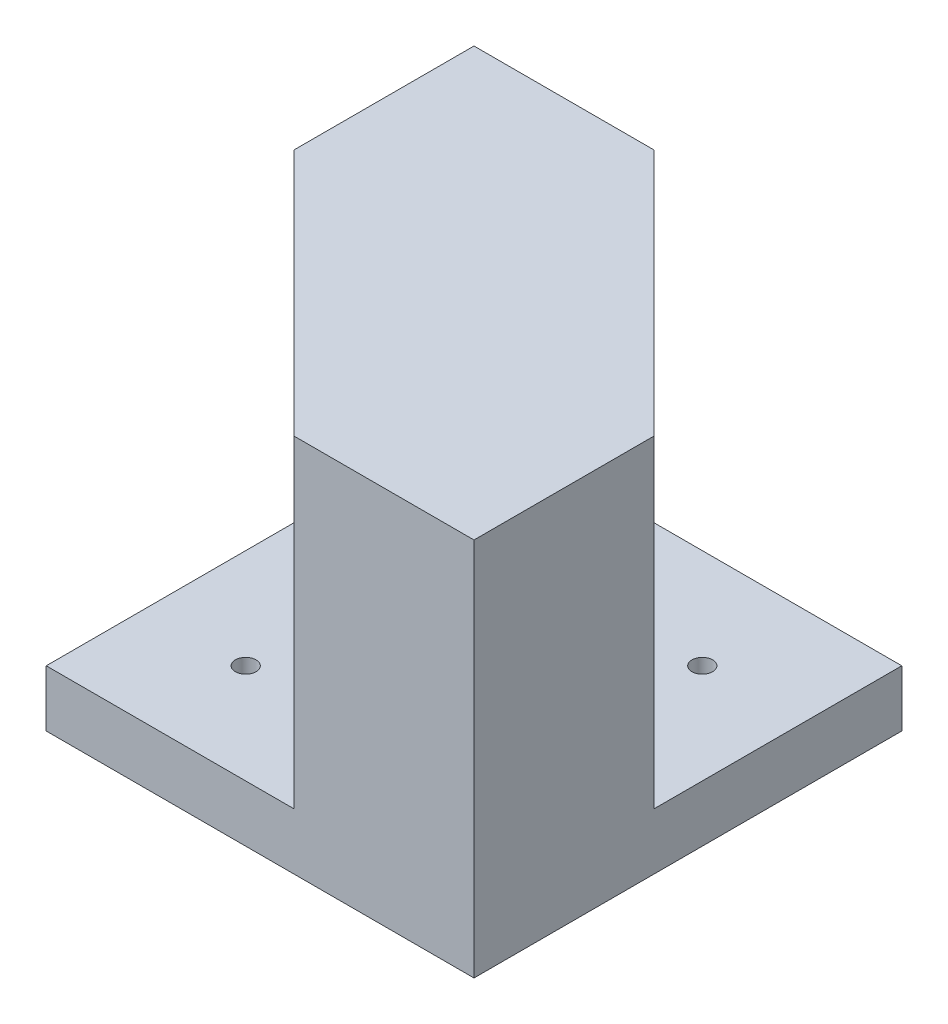
ISO-10303-21;
HEADER;
FILE_DESCRIPTION(('STEP AP214'),'2;1');
FILE_NAME('part.step','',(''),(''),'','','');
FILE_SCHEMA(('AUTOMOTIVE_DESIGN { 1 0 10303 214 1 1 1 1 }'));
ENDSEC;
DATA;
#1=APPLICATION_CONTEXT('core data for automotive mechanical design processes');
#2=APPLICATION_PROTOCOL_DEFINITION('international standard','automotive_design',2000,#1);
#3=PRODUCT_CONTEXT('',#1,'mechanical');
#4=PRODUCT('Part','Part','',(#3));
#5=PRODUCT_RELATED_PRODUCT_CATEGORY('part','',(#4));
#6=PRODUCT_DEFINITION_FORMATION('','',#4);
#7=PRODUCT_DEFINITION_CONTEXT('part definition',#1,'design');
#8=PRODUCT_DEFINITION('design','',#6,#7);
#9=PRODUCT_DEFINITION_SHAPE('','',#8);
#10=(LENGTH_UNIT() NAMED_UNIT(*) SI_UNIT(.MILLI.,.METRE.));
#11=(NAMED_UNIT(*) PLANE_ANGLE_UNIT() SI_UNIT($,.RADIAN.));
#12=(NAMED_UNIT(*) SI_UNIT($,.STERADIAN.) SOLID_ANGLE_UNIT());
#13=UNCERTAINTY_MEASURE_WITH_UNIT(LENGTH_MEASURE(1.E-05),#10,'distance_accuracy_value','');
#14=(GEOMETRIC_REPRESENTATION_CONTEXT(3) GLOBAL_UNCERTAINTY_ASSIGNED_CONTEXT((#13)) GLOBAL_UNIT_ASSIGNED_CONTEXT((#10,
#11,#12)) REPRESENTATION_CONTEXT('',''));
#15=CARTESIAN_POINT('',(0.,0.,0.));
#16=DIRECTION('',(0.,0.,1.));
#17=DIRECTION('',(1.,0.,0.));
#18=AXIS2_PLACEMENT_3D('',#15,#16,#17);
#19=CARTESIAN_POINT('',(0.,8.89,0.));
#20=DIRECTION('',(0.,1.,0.));
#21=DIRECTION('',(0.,0.,1.));
#22=AXIS2_PLACEMENT_3D('',#19,#20,#21);
#23=PLANE('',#22);
#24=DIRECTION('',(-0.707106781186546,0.,-0.707106781186549));
#25=VECTOR('',#24,1.);
#26=CARTESIAN_POINT('',(14.142135623731,8.89,-14.1421356237309));
#27=LINE('',#26,#25);
#28=CARTESIAN_POINT('',(33.655,8.89,5.37072875253817));
#29=VERTEX_POINT('',#28);
#30=CARTESIAN_POINT('',(-5.37072875253806,8.89,-33.655));
#31=VERTEX_POINT('',#30);
#32=EDGE_CURVE('E131',#29,#31,#27,.T.);
#33=ORIENTED_EDGE('',*,*,#32,.F.);
#34=DIRECTION('',(0.,0.,-1.));
#35=VECTOR('',#34,1.);
#36=CARTESIAN_POINT('',(33.655,8.89,-33.655));
#37=LINE('',#36,#35);
#38=CARTESIAN_POINT('',(33.655,8.89,-33.655));
#39=VERTEX_POINT('',#38);
#40=EDGE_CURVE('E154',#29,#39,#37,.T.);
#41=ORIENTED_EDGE('',*,*,#40,.T.);
#42=DIRECTION('',(-1.,0.,0.));
#43=VECTOR('',#42,1.);
#44=CARTESIAN_POINT('',(-33.655,8.89,-33.655));
#45=LINE('',#44,#43);
#46=EDGE_CURVE('E69',#39,#31,#45,.T.);
#47=ORIENTED_EDGE('',*,*,#46,.T.);
#48=EDGE_LOOP('',(#33,#41,#47));
#49=FACE_BOUND('',#48,.T.);
#50=CARTESIAN_POINT('',(17.9605122421383,8.89,-17.9605122421383));
#51=DIRECTION('',(0.,1.,0.));
#52=DIRECTION('',(0.,0.,1.));
#53=AXIS2_PLACEMENT_3D('',#50,#51,#52);
#54=CIRCLE('',#53,1.625);
#55=CARTESIAN_POINT('',(17.9605122421383,8.89,-16.3355122421383));
#56=VERTEX_POINT('',#55);
#57=EDGE_CURVE('E148',#56,#56,#54,.T.);
#58=ORIENTED_EDGE('',*,*,#57,.F.);
#59=EDGE_LOOP('',(#58));
#60=FACE_BOUND('',#59,.T.);
#61=ADVANCED_FACE('F44',(#49,#60),#23,.T.);
#62=DIRECTION('',(0.707106781186546,0.,0.707106781186549));
#63=VECTOR('',#62,1.);
#64=CARTESIAN_POINT('',(-14.142135623731,8.89,14.1421356237309));
#65=LINE('',#64,#63);
#66=CARTESIAN_POINT('',(-33.655,8.89,-5.37072875253819));
#67=VERTEX_POINT('',#66);
#68=CARTESIAN_POINT('',(5.37072875253804,8.89,33.655));
#69=VERTEX_POINT('',#68);
#70=EDGE_CURVE('E61',#67,#69,#65,.T.);
#71=ORIENTED_EDGE('',*,*,#70,.F.);
#72=DIRECTION('',(0.,0.,1.));
#73=VECTOR('',#72,1.);
#74=CARTESIAN_POINT('',(-33.655,8.89,-33.655));
#75=LINE('',#74,#73);
#76=CARTESIAN_POINT('',(-33.655,8.89,33.655));
#77=VERTEX_POINT('',#76);
#78=EDGE_CURVE('E135',#67,#77,#75,.T.);
#79=ORIENTED_EDGE('',*,*,#78,.T.);
#80=DIRECTION('',(1.,0.,0.));
#81=VECTOR('',#80,1.);
#82=CARTESIAN_POINT('',(-33.655,8.89,33.655));
#83=LINE('',#82,#81);
#84=EDGE_CURVE('E159',#77,#69,#83,.T.);
#85=ORIENTED_EDGE('',*,*,#84,.T.);
#86=EDGE_LOOP('',(#71,#79,#85));
#87=FACE_BOUND('',#86,.T.);
#88=CARTESIAN_POINT('',(-17.9605122421383,8.89,17.9605122421383));
#89=DIRECTION('',(0.,1.,0.));
#90=DIRECTION('',(0.,0.,1.));
#91=AXIS2_PLACEMENT_3D('',#88,#89,#90);
#92=CIRCLE('',#91,1.625);
#93=CARTESIAN_POINT('',(-17.9605122421383,8.89,19.5855122421383));
#94=VERTEX_POINT('',#93);
#95=EDGE_CURVE('E139',#94,#94,#92,.T.);
#96=ORIENTED_EDGE('',*,*,#95,.F.);
#97=EDGE_LOOP('',(#96));
#98=FACE_BOUND('',#97,.T.);
#99=ADVANCED_FACE('F257',(#87,#98),#23,.T.);
#100=CARTESIAN_POINT('',(0.,0.,0.));
#101=DIRECTION('',(0.,1.,0.));
#102=DIRECTION('',(0.,0.,1.));
#103=AXIS2_PLACEMENT_3D('',#100,#101,#102);
#104=PLANE('',#103);
#105=DIRECTION('',(0.,0.,-1.));
#106=VECTOR('',#105,1.);
#107=CARTESIAN_POINT('',(33.655,0.,-33.655));
#108=LINE('',#107,#106);
#109=CARTESIAN_POINT('',(33.655,0.,33.655));
#110=VERTEX_POINT('',#109);
#111=CARTESIAN_POINT('',(33.655,0.,-33.655));
#112=VERTEX_POINT('',#111);
#113=EDGE_CURVE('E151',#110,#112,#108,.T.);
#114=ORIENTED_EDGE('',*,*,#113,.F.);
#115=DIRECTION('',(1.,0.,0.));
#116=VECTOR('',#115,1.);
#117=CARTESIAN_POINT('',(-33.655,0.,33.655));
#118=LINE('',#117,#116);
#119=CARTESIAN_POINT('',(-33.655,0.,33.655));
#120=VERTEX_POINT('',#119);
#121=EDGE_CURVE('E156',#120,#110,#118,.T.);
#122=ORIENTED_EDGE('',*,*,#121,.F.);
#123=DIRECTION('',(0.,0.,1.));
#124=VECTOR('',#123,1.);
#125=CARTESIAN_POINT('',(-33.655,0.,-33.655));
#126=LINE('',#125,#124);
#127=CARTESIAN_POINT('',(-33.655,0.,-33.655));
#128=VERTEX_POINT('',#127);
#129=EDGE_CURVE('E166',#128,#120,#126,.T.);
#130=ORIENTED_EDGE('',*,*,#129,.F.);
#131=DIRECTION('',(-1.,0.,0.));
#132=VECTOR('',#131,1.);
#133=CARTESIAN_POINT('',(-33.655,0.,-33.655));
#134=LINE('',#133,#132);
#135=EDGE_CURVE('E164',#112,#128,#134,.T.);
#136=ORIENTED_EDGE('',*,*,#135,.F.);
#137=EDGE_LOOP('',(#114,#122,#130,#136));
#138=FACE_BOUND('',#137,.T.);
#139=CARTESIAN_POINT('',(17.9605122421383,0.,-17.9605122421383));
#140=DIRECTION('',(0.,1.,0.));
#141=DIRECTION('',(0.,0.,1.));
#142=AXIS2_PLACEMENT_3D('',#139,#140,#141);
#143=CIRCLE('',#142,1.625);
#144=CARTESIAN_POINT('',(17.9605122421383,0.,-16.3355122421383));
#145=VERTEX_POINT('',#144);
#146=EDGE_CURVE('E146',#145,#145,#143,.T.);
#147=ORIENTED_EDGE('',*,*,#146,.T.);
#148=EDGE_LOOP('',(#147));
#149=FACE_BOUND('',#148,.T.);
#150=CARTESIAN_POINT('',(-17.9605122421383,0.,17.9605122421383));
#151=DIRECTION('',(0.,1.,0.));
#152=DIRECTION('',(0.,0.,1.));
#153=AXIS2_PLACEMENT_3D('',#150,#151,#152);
#154=CIRCLE('',#153,1.625);
#155=CARTESIAN_POINT('',(-17.9605122421383,0.,19.5855122421383));
#156=VERTEX_POINT('',#155);
#157=EDGE_CURVE('E136',#156,#156,#154,.T.);
#158=ORIENTED_EDGE('',*,*,#157,.T.);
#159=EDGE_LOOP('',(#158));
#160=FACE_BOUND('',#159,.T.);
#161=ADVANCED_FACE('F263',(#138,#149,#160),#104,.F.);
#162=CARTESIAN_POINT('',(33.655,8.89,-33.655));
#163=DIRECTION('',(-1.,0.,0.));
#164=DIRECTION('',(0.,0.,1.));
#165=AXIS2_PLACEMENT_3D('',#162,#163,#164);
#166=PLANE('',#165);
#167=ORIENTED_EDGE('',*,*,#113,.T.);
#168=DIRECTION('',(0.,-1.,0.));
#169=VECTOR('',#168,1.);
#170=CARTESIAN_POINT('',(33.655,8.89,-33.655));
#171=LINE('',#170,#169);
#172=EDGE_CURVE('E11',#39,#112,#171,.T.);
#173=ORIENTED_EDGE('',*,*,#172,.F.);
#174=ORIENTED_EDGE('',*,*,#40,.F.);
#175=DIRECTION('',(0.,-1.,0.));
#176=VECTOR('',#175,1.);
#177=CARTESIAN_POINT('',(33.655,59.69,5.37072875253817));
#178=LINE('',#177,#176);
#179=CARTESIAN_POINT('',(33.655,59.69,5.37072875253817));
#180=VERTEX_POINT('',#179);
#181=EDGE_CURVE('E141',#180,#29,#178,.T.);
#182=ORIENTED_EDGE('',*,*,#181,.F.);
#183=DIRECTION('',(0.,0.,-1.));
#184=VECTOR('',#183,1.);
#185=CARTESIAN_POINT('',(33.655,59.69,0.));
#186=LINE('',#185,#184);
#187=CARTESIAN_POINT('',(33.655,59.69,33.655));
#188=VERTEX_POINT('',#187);
#189=EDGE_CURVE('E208',#188,#180,#186,.T.);
#190=ORIENTED_EDGE('',*,*,#189,.F.);
#191=DIRECTION('',(0.,-1.,0.));
#192=VECTOR('',#191,1.);
#193=CARTESIAN_POINT('',(33.655,8.89,33.655));
#194=LINE('',#193,#192);
#195=EDGE_CURVE('E161',#188,#110,#194,.T.);
#196=ORIENTED_EDGE('',*,*,#195,.T.);
#197=EDGE_LOOP('',(#167,#173,#174,#182,#190,#196));
#198=FACE_BOUND('',#197,.T.);
#199=ADVANCED_FACE('F46',(#198),#166,.F.);
#200=CARTESIAN_POINT('',(-33.655,8.89,-33.655));
#201=DIRECTION('',(0.,0.,1.));
#202=DIRECTION('',(1.,0.,0.));
#203=AXIS2_PLACEMENT_3D('',#200,#201,#202);
#204=PLANE('',#203);
#205=ORIENTED_EDGE('',*,*,#135,.T.);
#206=DIRECTION('',(0.,-1.,0.));
#207=VECTOR('',#206,1.);
#208=CARTESIAN_POINT('',(-33.655,8.89,-33.655));
#209=LINE('',#208,#207);
#210=CARTESIAN_POINT('',(-33.655,59.69,-33.655));
#211=VERTEX_POINT('',#210);
#212=EDGE_CURVE('E53',#211,#128,#209,.T.);
#213=ORIENTED_EDGE('',*,*,#212,.F.);
#214=DIRECTION('',(-1.,0.,0.));
#215=VECTOR('',#214,1.);
#216=CARTESIAN_POINT('',(0.,59.69,-33.655));
#217=LINE('',#216,#215);
#218=CARTESIAN_POINT('',(-5.37072875253805,59.69,-33.655));
#219=VERTEX_POINT('',#218);
#220=EDGE_CURVE('E128',#219,#211,#217,.T.);
#221=ORIENTED_EDGE('',*,*,#220,.F.);
#222=DIRECTION('',(0.,-1.,0.));
#223=VECTOR('',#222,1.);
#224=CARTESIAN_POINT('',(-5.37072875253805,59.69,-33.655));
#225=LINE('',#224,#223);
#226=EDGE_CURVE('E196',#219,#31,#225,.T.);
#227=ORIENTED_EDGE('',*,*,#226,.T.);
#228=ORIENTED_EDGE('',*,*,#46,.F.);
#229=ORIENTED_EDGE('',*,*,#172,.T.);
#230=EDGE_LOOP('',(#205,#213,#221,#227,#228,#229));
#231=FACE_BOUND('',#230,.T.);
#232=ADVANCED_FACE('F212',(#231),#204,.F.);
#233=CARTESIAN_POINT('',(-33.655,8.89,-33.655));
#234=DIRECTION('',(1.,0.,0.));
#235=DIRECTION('',(0.,0.,-1.));
#236=AXIS2_PLACEMENT_3D('',#233,#234,#235);
#237=PLANE('',#236);
#238=ORIENTED_EDGE('',*,*,#129,.T.);
#239=DIRECTION('',(0.,-1.,0.));
#240=VECTOR('',#239,1.);
#241=CARTESIAN_POINT('',(-33.655,8.89,33.655));
#242=LINE('',#241,#240);
#243=EDGE_CURVE('E171',#77,#120,#242,.T.);
#244=ORIENTED_EDGE('',*,*,#243,.F.);
#245=ORIENTED_EDGE('',*,*,#78,.F.);
#246=DIRECTION('',(0.,-1.,0.));
#247=VECTOR('',#246,1.);
#248=CARTESIAN_POINT('',(-33.655,59.69,-5.37072875253817));
#249=LINE('',#248,#247);
#250=CARTESIAN_POINT('',(-33.655,59.69,-5.37072875253817));
#251=VERTEX_POINT('',#250);
#252=EDGE_CURVE('E115',#251,#67,#249,.T.);
#253=ORIENTED_EDGE('',*,*,#252,.F.);
#254=DIRECTION('',(0.,0.,1.));
#255=VECTOR('',#254,1.);
#256=CARTESIAN_POINT('',(-33.655,59.69,0.));
#257=LINE('',#256,#255);
#258=EDGE_CURVE('E122',#211,#251,#257,.T.);
#259=ORIENTED_EDGE('',*,*,#258,.F.);
#260=ORIENTED_EDGE('',*,*,#212,.T.);
#261=EDGE_LOOP('',(#238,#244,#245,#253,#259,#260));
#262=FACE_BOUND('',#261,.T.);
#263=ADVANCED_FACE('F133',(#262),#237,.F.);
#264=CARTESIAN_POINT('',(-33.655,8.89,33.655));
#265=DIRECTION('',(0.,0.,-1.));
#266=DIRECTION('',(-1.,0.,0.));
#267=AXIS2_PLACEMENT_3D('',#264,#265,#266);
#268=PLANE('',#267);
#269=ORIENTED_EDGE('',*,*,#121,.T.);
#270=ORIENTED_EDGE('',*,*,#195,.F.);
#271=DIRECTION('',(1.,0.,0.));
#272=VECTOR('',#271,1.);
#273=CARTESIAN_POINT('',(0.,59.69,33.655));
#274=LINE('',#273,#272);
#275=CARTESIAN_POINT('',(5.37072875253804,59.69,33.655));
#276=VERTEX_POINT('',#275);
#277=EDGE_CURVE('E121',#276,#188,#274,.T.);
#278=ORIENTED_EDGE('',*,*,#277,.F.);
#279=DIRECTION('',(0.,-1.,0.));
#280=VECTOR('',#279,1.);
#281=CARTESIAN_POINT('',(5.37072875253804,59.69,33.655));
#282=LINE('',#281,#280);
#283=EDGE_CURVE('E117',#276,#69,#282,.T.);
#284=ORIENTED_EDGE('',*,*,#283,.T.);
#285=ORIENTED_EDGE('',*,*,#84,.F.);
#286=ORIENTED_EDGE('',*,*,#243,.T.);
#287=EDGE_LOOP('',(#269,#270,#278,#284,#285,#286));
#288=FACE_BOUND('',#287,.T.);
#289=ADVANCED_FACE('F271',(#288),#268,.F.);
#290=CARTESIAN_POINT('',(17.9605122421383,8.89,-17.9605122421383));
#291=DIRECTION('',(0.,-1.,0.));
#292=DIRECTION('',(0.,0.,-1.));
#293=AXIS2_PLACEMENT_3D('',#290,#291,#292);
#294=CYLINDRICAL_SURFACE('',#293,1.625);
#295=ORIENTED_EDGE('',*,*,#57,.T.);
#296=EDGE_LOOP('',(#295));
#297=FACE_BOUND('',#296,.T.);
#298=ORIENTED_EDGE('',*,*,#146,.F.);
#299=EDGE_LOOP('',(#298));
#300=FACE_BOUND('',#299,.T.);
#301=ADVANCED_FACE('F266',(#297,#300),#294,.F.);
#302=CARTESIAN_POINT('',(-17.9605122421383,8.89,17.9605122421383));
#303=DIRECTION('',(0.,-1.,0.));
#304=DIRECTION('',(0.,0.,-1.));
#305=AXIS2_PLACEMENT_3D('',#302,#303,#304);
#306=CYLINDRICAL_SURFACE('',#305,1.625);
#307=ORIENTED_EDGE('',*,*,#95,.T.);
#308=EDGE_LOOP('',(#307));
#309=FACE_BOUND('',#308,.T.);
#310=ORIENTED_EDGE('',*,*,#157,.F.);
#311=EDGE_LOOP('',(#310));
#312=FACE_BOUND('',#311,.T.);
#313=ADVANCED_FACE('F236',(#309,#312),#306,.F.);
#314=CARTESIAN_POINT('',(-14.142135623731,59.69,14.1421356237309));
#315=DIRECTION('',(0.707106781186549,0.,-0.707106781186546));
#316=DIRECTION('',(-0.707106781186546,0.,-0.707106781186549));
#317=AXIS2_PLACEMENT_3D('',#314,#315,#316);
#318=PLANE('',#317);
#319=CARTESIAN_POINT('',(-1.44213562373103,16.3294877578617,26.8421356237309));
#320=DIRECTION('',(-0.707106781186549,0.,0.707106781186546));
#321=DIRECTION('',(0.707106781186546,0.,0.707106781186549));
#322=AXIS2_PLACEMENT_3D('',#319,#320,#321);
#323=CIRCLE('',#322,2.);
#324=CARTESIAN_POINT('',(-0.0279220613579373,16.3294877578617,28.256349186104));
#325=VERTEX_POINT('',#324);
#326=EDGE_CURVE('E218',#325,#325,#323,.T.);
#327=ORIENTED_EDGE('',*,*,#326,.F.);
#328=EDGE_LOOP('',(#327));
#329=FACE_BOUND('',#328,.T.);
#330=CARTESIAN_POINT('',(-14.142135623731,34.29,14.1421356237309));
#331=DIRECTION('',(-0.707106781186549,0.,0.707106781186546));
#332=DIRECTION('',(0.707106781186546,0.,0.707106781186549));
#333=AXIS2_PLACEMENT_3D('',#330,#331,#332);
#334=CIRCLE('',#333,2.);
#335=CARTESIAN_POINT('',(-12.7279220613579,34.29,15.556349186104));
#336=VERTEX_POINT('',#335);
#337=EDGE_CURVE('E219',#336,#336,#334,.T.);
#338=ORIENTED_EDGE('',*,*,#337,.F.);
#339=EDGE_LOOP('',(#338));
#340=FACE_BOUND('',#339,.T.);
#341=CARTESIAN_POINT('',(-1.44213562373103,52.2505122421383,26.8421356237309));
#342=DIRECTION('',(-0.707106781186549,0.,0.707106781186546));
#343=DIRECTION('',(0.707106781186546,0.,0.707106781186549));
#344=AXIS2_PLACEMENT_3D('',#341,#342,#343);
#345=CIRCLE('',#344,2.);
#346=CARTESIAN_POINT('',(-0.0279220613579366,52.2505122421383,28.256349186104));
#347=VERTEX_POINT('',#346);
#348=EDGE_CURVE('E222',#347,#347,#345,.T.);
#349=ORIENTED_EDGE('',*,*,#348,.F.);
#350=EDGE_LOOP('',(#349));
#351=FACE_BOUND('',#350,.T.);
#352=CARTESIAN_POINT('',(-26.8421356237309,16.3294877578617,1.44213562373093));
#353=DIRECTION('',(-0.707106781186549,0.,0.707106781186546));
#354=DIRECTION('',(0.707106781186546,0.,0.707106781186549));
#355=AXIS2_PLACEMENT_3D('',#352,#353,#354);
#356=CIRCLE('',#355,2.);
#357=CARTESIAN_POINT('',(-25.4279220613578,16.3294877578617,2.85634918610403));
#358=VERTEX_POINT('',#357);
#359=EDGE_CURVE('E225',#358,#358,#356,.T.);
#360=ORIENTED_EDGE('',*,*,#359,.F.);
#361=EDGE_LOOP('',(#360));
#362=FACE_BOUND('',#361,.T.);
#363=CARTESIAN_POINT('',(-26.8421356237309,52.2505122421383,1.44213562373093));
#364=DIRECTION('',(-0.707106781186549,0.,0.707106781186546));
#365=DIRECTION('',(0.707106781186546,0.,0.707106781186549));
#366=AXIS2_PLACEMENT_3D('',#363,#364,#365);
#367=CIRCLE('',#366,2.);
#368=CARTESIAN_POINT('',(-25.4279220613578,52.2505122421383,2.85634918610403));
#369=VERTEX_POINT('',#368);
#370=EDGE_CURVE('E179',#369,#369,#367,.T.);
#371=ORIENTED_EDGE('',*,*,#370,.F.);
#372=EDGE_LOOP('',(#371));
#373=FACE_BOUND('',#372,.T.);
#374=ORIENTED_EDGE('',*,*,#70,.T.);
#375=ORIENTED_EDGE('',*,*,#283,.F.);
#376=DIRECTION('',(0.707106781186546,0.,0.707106781186549));
#377=VECTOR('',#376,1.);
#378=CARTESIAN_POINT('',(-14.142135623731,59.69,14.1421356237309));
#379=LINE('',#378,#377);
#380=EDGE_CURVE('E111',#251,#276,#379,.T.);
#381=ORIENTED_EDGE('',*,*,#380,.F.);
#382=ORIENTED_EDGE('',*,*,#252,.T.);
#383=EDGE_LOOP('',(#374,#375,#381,#382));
#384=FACE_BOUND('',#383,.T.);
#385=ADVANCED_FACE('F113',(#329,#340,#351,#362,#373,#384),#318,.F.);
#386=CARTESIAN_POINT('',(14.142135623731,59.69,-14.1421356237309));
#387=DIRECTION('',(-0.707106781186549,0.,0.707106781186546));
#388=DIRECTION('',(0.707106781186546,0.,0.707106781186549));
#389=AXIS2_PLACEMENT_3D('',#386,#387,#388);
#390=PLANE('',#389);
#391=CARTESIAN_POINT('',(26.8421356237309,16.3294877578617,-1.44213562373093));
#392=DIRECTION('',(-0.707106781186549,0.,0.707106781186546));
#393=DIRECTION('',(0.707106781186546,0.,0.707106781186549));
#394=AXIS2_PLACEMENT_3D('',#391,#392,#393);
#395=CIRCLE('',#394,2.);
#396=CARTESIAN_POINT('',(28.256349186104,16.3294877578617,-0.0279220613578302));
#397=VERTEX_POINT('',#396);
#398=EDGE_CURVE('E48',#397,#397,#395,.T.);
#399=ORIENTED_EDGE('',*,*,#398,.T.);
#400=EDGE_LOOP('',(#399));
#401=FACE_BOUND('',#400,.T.);
#402=CARTESIAN_POINT('',(14.142135623731,34.29,-14.1421356237309));
#403=DIRECTION('',(-0.707106781186549,0.,0.707106781186546));
#404=DIRECTION('',(0.707106781186546,0.,0.707106781186549));
#405=AXIS2_PLACEMENT_3D('',#402,#403,#404);
#406=CIRCLE('',#405,2.);
#407=CARTESIAN_POINT('',(15.5563491861041,34.29,-12.7279220613578));
#408=VERTEX_POINT('',#407);
#409=EDGE_CURVE('E184',#408,#408,#406,.T.);
#410=ORIENTED_EDGE('',*,*,#409,.T.);
#411=EDGE_LOOP('',(#410));
#412=FACE_BOUND('',#411,.T.);
#413=CARTESIAN_POINT('',(26.8421356237309,52.2505122421383,-1.44213562373093));
#414=DIRECTION('',(-0.707106781186549,0.,0.707106781186546));
#415=DIRECTION('',(0.707106781186546,0.,0.707106781186549));
#416=AXIS2_PLACEMENT_3D('',#413,#414,#415);
#417=CIRCLE('',#416,2.);
#418=CARTESIAN_POINT('',(28.256349186104,52.2505122421383,-0.0279220613578297));
#419=VERTEX_POINT('',#418);
#420=EDGE_CURVE('E182',#419,#419,#417,.T.);
#421=ORIENTED_EDGE('',*,*,#420,.T.);
#422=EDGE_LOOP('',(#421));
#423=FACE_BOUND('',#422,.T.);
#424=CARTESIAN_POINT('',(1.44213562373101,16.3294877578617,-26.8421356237309));
#425=DIRECTION('',(-0.707106781186549,0.,0.707106781186546));
#426=DIRECTION('',(0.707106781186546,0.,0.707106781186549));
#427=AXIS2_PLACEMENT_3D('',#424,#425,#426);
#428=CIRCLE('',#427,2.);
#429=CARTESIAN_POINT('',(2.8563491861041,16.3294877578617,-25.4279220613578));
#430=VERTEX_POINT('',#429);
#431=EDGE_CURVE('E178',#430,#430,#428,.T.);
#432=ORIENTED_EDGE('',*,*,#431,.T.);
#433=EDGE_LOOP('',(#432));
#434=FACE_BOUND('',#433,.T.);
#435=CARTESIAN_POINT('',(1.44213562373101,52.2505122421383,-26.8421356237309));
#436=DIRECTION('',(-0.707106781186549,0.,0.707106781186546));
#437=DIRECTION('',(0.707106781186546,0.,0.707106781186549));
#438=AXIS2_PLACEMENT_3D('',#435,#436,#437);
#439=CIRCLE('',#438,2.);
#440=CARTESIAN_POINT('',(2.8563491861041,52.2505122421383,-25.4279220613578));
#441=VERTEX_POINT('',#440);
#442=EDGE_CURVE('E175',#441,#441,#439,.T.);
#443=ORIENTED_EDGE('',*,*,#442,.T.);
#444=EDGE_LOOP('',(#443));
#445=FACE_BOUND('',#444,.T.);
#446=ORIENTED_EDGE('',*,*,#32,.T.);
#447=ORIENTED_EDGE('',*,*,#226,.F.);
#448=DIRECTION('',(-0.707106781186546,0.,-0.707106781186549));
#449=VECTOR('',#448,1.);
#450=CARTESIAN_POINT('',(14.142135623731,59.69,-14.1421356237309));
#451=LINE('',#450,#449);
#452=EDGE_CURVE('E204',#180,#219,#451,.T.);
#453=ORIENTED_EDGE('',*,*,#452,.F.);
#454=ORIENTED_EDGE('',*,*,#181,.T.);
#455=EDGE_LOOP('',(#446,#447,#453,#454));
#456=FACE_BOUND('',#455,.T.);
#457=ADVANCED_FACE('F202',(#401,#412,#423,#434,#445,#456),#390,.F.);
#458=CARTESIAN_POINT('',(0.,59.69,0.));
#459=DIRECTION('',(0.,1.,0.));
#460=DIRECTION('',(0.,0.,1.));
#461=AXIS2_PLACEMENT_3D('',#458,#459,#460);
#462=PLANE('',#461);
#463=ORIENTED_EDGE('',*,*,#258,.T.);
#464=ORIENTED_EDGE('',*,*,#380,.T.);
#465=ORIENTED_EDGE('',*,*,#277,.T.);
#466=ORIENTED_EDGE('',*,*,#189,.T.);
#467=ORIENTED_EDGE('',*,*,#452,.T.);
#468=ORIENTED_EDGE('',*,*,#220,.T.);
#469=EDGE_LOOP('',(#463,#464,#465,#466,#467,#468));
#470=FACE_BOUND('',#469,.T.);
#471=ADVANCED_FACE('F126',(#470),#462,.T.);
#472=CARTESIAN_POINT('',(62.9604255869608,52.2505122421383,-88.3604255869605));
#473=DIRECTION('',(-0.707106781186549,0.,0.707106781186546));
#474=DIRECTION('',(0.707106781186546,0.,0.707106781186549));
#475=AXIS2_PLACEMENT_3D('',#472,#473,#474);
#476=CYLINDRICAL_SURFACE('',#475,2.);
#477=ORIENTED_EDGE('',*,*,#370,.T.);
#478=EDGE_LOOP('',(#477));
#479=FACE_BOUND('',#478,.T.);
#480=ORIENTED_EDGE('',*,*,#442,.F.);
#481=EDGE_LOOP('',(#480));
#482=FACE_BOUND('',#481,.T.);
#483=ADVANCED_FACE('F243',(#479,#482),#476,.F.);
#484=CARTESIAN_POINT('',(62.9604255869608,16.3294877578617,-88.3604255869605));
#485=DIRECTION('',(-0.707106781186549,0.,0.707106781186546));
#486=DIRECTION('',(0.707106781186546,0.,0.707106781186549));
#487=AXIS2_PLACEMENT_3D('',#484,#485,#486);
#488=CYLINDRICAL_SURFACE('',#487,2.);
#489=ORIENTED_EDGE('',*,*,#359,.T.);
#490=EDGE_LOOP('',(#489));
#491=FACE_BOUND('',#490,.T.);
#492=ORIENTED_EDGE('',*,*,#431,.F.);
#493=EDGE_LOOP('',(#492));
#494=FACE_BOUND('',#493,.T.);
#495=ADVANCED_FACE('F246',(#491,#494),#488,.F.);
#496=CARTESIAN_POINT('',(88.3604255869607,52.2505122421383,-62.9604255869605));
#497=DIRECTION('',(-0.707106781186549,0.,0.707106781186546));
#498=DIRECTION('',(0.707106781186546,0.,0.707106781186549));
#499=AXIS2_PLACEMENT_3D('',#496,#497,#498);
#500=CYLINDRICAL_SURFACE('',#499,2.);
#501=ORIENTED_EDGE('',*,*,#348,.T.);
#502=EDGE_LOOP('',(#501));
#503=FACE_BOUND('',#502,.T.);
#504=ORIENTED_EDGE('',*,*,#420,.F.);
#505=EDGE_LOOP('',(#504));
#506=FACE_BOUND('',#505,.T.);
#507=ADVANCED_FACE('F231',(#503,#506),#500,.F.);
#508=CARTESIAN_POINT('',(75.6604255869607,34.29,-75.6604255869605));
#509=DIRECTION('',(-0.707106781186549,0.,0.707106781186546));
#510=DIRECTION('',(0.707106781186546,0.,0.707106781186549));
#511=AXIS2_PLACEMENT_3D('',#508,#509,#510);
#512=CYLINDRICAL_SURFACE('',#511,2.);
#513=ORIENTED_EDGE('',*,*,#337,.T.);
#514=EDGE_LOOP('',(#513));
#515=FACE_BOUND('',#514,.T.);
#516=ORIENTED_EDGE('',*,*,#409,.F.);
#517=EDGE_LOOP('',(#516));
#518=FACE_BOUND('',#517,.T.);
#519=ADVANCED_FACE('F387',(#515,#518),#512,.F.);
#520=CARTESIAN_POINT('',(88.3604255869607,16.3294877578617,-62.9604255869605));
#521=DIRECTION('',(-0.707106781186549,0.,0.707106781186546));
#522=DIRECTION('',(0.707106781186546,0.,0.707106781186549));
#523=AXIS2_PLACEMENT_3D('',#520,#521,#522);
#524=CYLINDRICAL_SURFACE('',#523,2.);
#525=ORIENTED_EDGE('',*,*,#326,.T.);
#526=EDGE_LOOP('',(#525));
#527=FACE_BOUND('',#526,.T.);
#528=ORIENTED_EDGE('',*,*,#398,.F.);
#529=EDGE_LOOP('',(#528));
#530=FACE_BOUND('',#529,.T.);
#531=ADVANCED_FACE('F395',(#527,#530),#524,.F.);
#532=CLOSED_SHELL('',(#61,#99,#161,#199,#232,#263,#289,#301,#313,#385,#457,#471,#483,#495,#507,
#519,#531));
#533=MANIFOLD_SOLID_BREP('B2',#532);
#534=ADVANCED_BREP_SHAPE_REPRESENTATION('',(#18,#533),#14);
#535=SHAPE_DEFINITION_REPRESENTATION(#9,#534);
ENDSEC;
END-ISO-10303-21;
